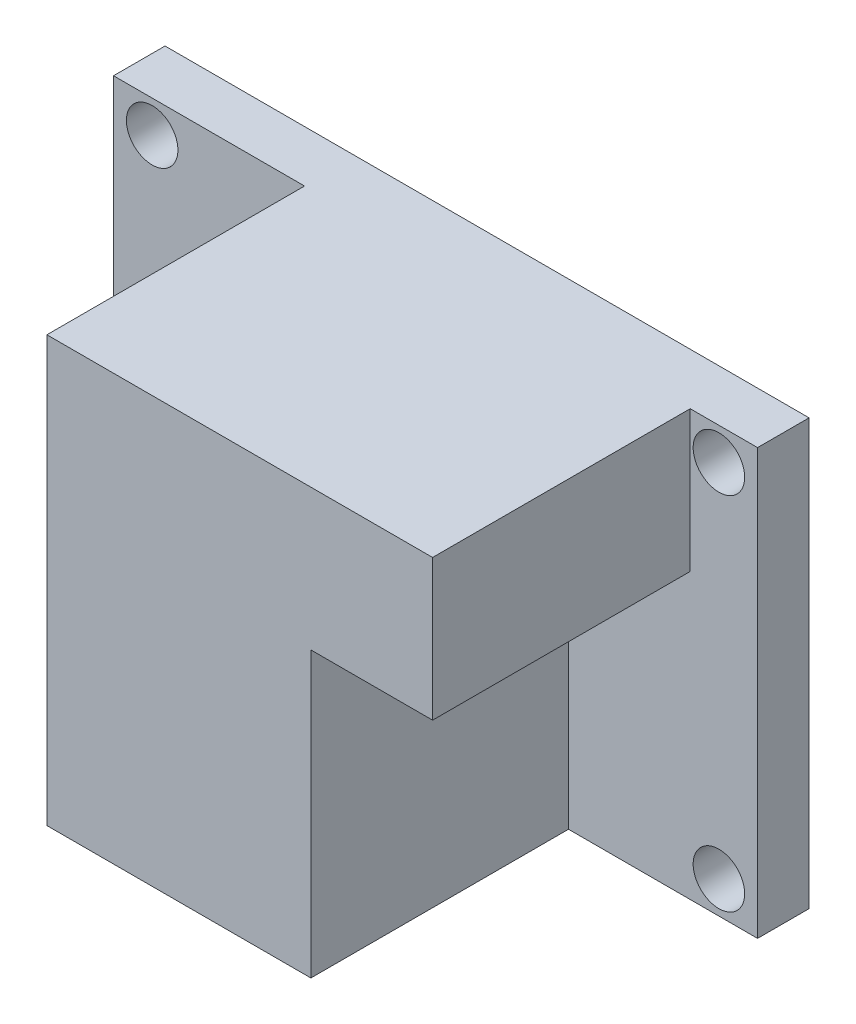
ISO-10303-21;
HEADER;
FILE_DESCRIPTION(('STEP AP214'),'2;1');
FILE_NAME('part.step','',(''),(''),'','','');
FILE_SCHEMA(('AUTOMOTIVE_DESIGN { 1 0 10303 214 1 1 1 1 }'));
ENDSEC;
DATA;
#1=APPLICATION_CONTEXT('core data for automotive mechanical design processes');
#2=APPLICATION_PROTOCOL_DEFINITION('international standard','automotive_design',2000,#1);
#3=PRODUCT_CONTEXT('',#1,'mechanical');
#4=PRODUCT('Part','Part','',(#3));
#5=PRODUCT_RELATED_PRODUCT_CATEGORY('part','',(#4));
#6=PRODUCT_DEFINITION_FORMATION('','',#4);
#7=PRODUCT_DEFINITION_CONTEXT('part definition',#1,'design');
#8=PRODUCT_DEFINITION('design','',#6,#7);
#9=PRODUCT_DEFINITION_SHAPE('','',#8);
#10=(LENGTH_UNIT() NAMED_UNIT(*) SI_UNIT(.MILLI.,.METRE.));
#11=(NAMED_UNIT(*) PLANE_ANGLE_UNIT() SI_UNIT($,.RADIAN.));
#12=(NAMED_UNIT(*) SI_UNIT($,.STERADIAN.) SOLID_ANGLE_UNIT());
#13=UNCERTAINTY_MEASURE_WITH_UNIT(LENGTH_MEASURE(1.E-05),#10,'distance_accuracy_value','');
#14=(GEOMETRIC_REPRESENTATION_CONTEXT(3) GLOBAL_UNCERTAINTY_ASSIGNED_CONTEXT((#13)) GLOBAL_UNIT_ASSIGNED_CONTEXT((#10,
#11,#12)) REPRESENTATION_CONTEXT('',''));
#15=CARTESIAN_POINT('',(0.,0.,0.));
#16=DIRECTION('',(0.,0.,1.));
#17=DIRECTION('',(1.,0.,0.));
#18=AXIS2_PLACEMENT_3D('',#15,#16,#17);
#19=CARTESIAN_POINT('',(0.,0.,4.));
#20=DIRECTION('',(0.,0.,1.));
#21=DIRECTION('',(1.,0.,0.));
#22=AXIS2_PLACEMENT_3D('',#19,#20,#21);
#23=PLANE('',#22);
#24=CARTESIAN_POINT('',(3.,30.5,4.));
#25=DIRECTION('',(0.,0.,1.));
#26=DIRECTION('',(1.,0.,0.));
#27=AXIS2_PLACEMENT_3D('',#24,#25,#26);
#28=CIRCLE('',#27,2.);
#29=CARTESIAN_POINT('',(5.,30.5,4.));
#30=VERTEX_POINT('',#29);
#31=EDGE_CURVE('E191',#30,#30,#28,.T.);
#32=ORIENTED_EDGE('',*,*,#31,.F.);
#33=EDGE_LOOP('',(#32));
#34=FACE_BOUND('',#33,.T.);
#35=CARTESIAN_POINT('',(3.00000000000001,2.5,4.));
#36=DIRECTION('',(0.,0.,1.));
#37=DIRECTION('',(1.,0.,0.));
#38=AXIS2_PLACEMENT_3D('',#35,#36,#37);
#39=CIRCLE('',#38,2.);
#40=CARTESIAN_POINT('',(5.00000000000001,2.5,4.));
#41=VERTEX_POINT('',#40);
#42=EDGE_CURVE('E188',#41,#41,#39,.T.);
#43=ORIENTED_EDGE('',*,*,#42,.F.);
#44=EDGE_LOOP('',(#43));
#45=FACE_BOUND('',#44,.T.);
#46=DIRECTION('',(1.,0.,0.));
#47=VECTOR('',#46,1.);
#48=CARTESIAN_POINT('',(0.,0.,4.));
#49=LINE('',#48,#47);
#50=CARTESIAN_POINT('',(0.,0.,4.));
#51=VERTEX_POINT('',#50);
#52=CARTESIAN_POINT('',(14.8297135358286,0.,4.));
#53=VERTEX_POINT('',#52);
#54=EDGE_CURVE('E179',#51,#53,#49,.T.);
#55=ORIENTED_EDGE('',*,*,#54,.T.);
#56=DIRECTION('',(0.,1.,0.));
#57=VECTOR('',#56,1.);
#58=CARTESIAN_POINT('',(14.8297135358286,0.,4.));
#59=LINE('',#58,#57);
#60=CARTESIAN_POINT('',(14.8297135358286,33.,4.));
#61=VERTEX_POINT('',#60);
#62=EDGE_CURVE('E176',#53,#61,#59,.T.);
#63=ORIENTED_EDGE('',*,*,#62,.T.);
#64=DIRECTION('',(1.,0.,0.));
#65=VECTOR('',#64,1.);
#66=CARTESIAN_POINT('',(0.,33.,4.));
#67=LINE('',#66,#65);
#68=CARTESIAN_POINT('',(0.,33.,4.));
#69=VERTEX_POINT('',#68);
#70=EDGE_CURVE('E134',#69,#61,#67,.T.);
#71=ORIENTED_EDGE('',*,*,#70,.F.);
#72=DIRECTION('',(0.,1.,0.));
#73=VECTOR('',#72,1.);
#74=CARTESIAN_POINT('',(0.,0.,4.));
#75=LINE('',#74,#73);
#76=EDGE_CURVE('E186',#51,#69,#75,.T.);
#77=ORIENTED_EDGE('',*,*,#76,.F.);
#78=EDGE_LOOP('',(#55,#63,#71,#77));
#79=FACE_BOUND('',#78,.T.);
#80=ADVANCED_FACE('F39',(#34,#45,#79),#23,.T.);
#81=CARTESIAN_POINT('',(0.,0.,4.));
#82=DIRECTION('',(0.,1.,0.));
#83=DIRECTION('',(0.,0.,1.));
#84=AXIS2_PLACEMENT_3D('',#81,#82,#83);
#85=PLANE('',#84);
#86=CARTESIAN_POINT('',(35.3229395715336,0.,4.));
#87=VERTEX_POINT('',#86);
#88=CARTESIAN_POINT('',(50.,0.,4.));
#89=VERTEX_POINT('',#88);
#90=EDGE_CURVE('E89',#87,#89,#49,.T.);
#91=ORIENTED_EDGE('',*,*,#90,.F.);
#92=DIRECTION('',(0.,0.,-1.));
#93=VECTOR('',#92,1.);
#94=CARTESIAN_POINT('',(35.3229395715336,0.,24.));
#95=LINE('',#94,#93);
#96=CARTESIAN_POINT('',(35.3229395715336,0.,24.));
#97=VERTEX_POINT('',#96);
#98=EDGE_CURVE('E166',#97,#87,#95,.T.);
#99=ORIENTED_EDGE('',*,*,#98,.F.);
#100=DIRECTION('',(1.,0.,0.));
#101=VECTOR('',#100,1.);
#102=CARTESIAN_POINT('',(0.,0.,24.));
#103=LINE('',#102,#101);
#104=CARTESIAN_POINT('',(14.8297135358286,0.,24.));
#105=VERTEX_POINT('',#104);
#106=EDGE_CURVE('E146',#105,#97,#103,.T.);
#107=ORIENTED_EDGE('',*,*,#106,.F.);
#108=DIRECTION('',(0.,0.,-1.));
#109=VECTOR('',#108,1.);
#110=CARTESIAN_POINT('',(14.8297135358286,0.,24.));
#111=LINE('',#110,#109);
#112=EDGE_CURVE('E138',#105,#53,#111,.T.);
#113=ORIENTED_EDGE('',*,*,#112,.T.);
#114=ORIENTED_EDGE('',*,*,#54,.F.);
#115=DIRECTION('',(0.,0.,-1.));
#116=VECTOR('',#115,1.);
#117=CARTESIAN_POINT('',(0.,0.,4.));
#118=LINE('',#117,#116);
#119=CARTESIAN_POINT('',(0.,0.,0.));
#120=VERTEX_POINT('',#119);
#121=EDGE_CURVE('E63',#51,#120,#118,.T.);
#122=ORIENTED_EDGE('',*,*,#121,.T.);
#123=DIRECTION('',(1.,0.,0.));
#124=VECTOR('',#123,1.);
#125=CARTESIAN_POINT('',(0.,0.,0.));
#126=LINE('',#125,#124);
#127=CARTESIAN_POINT('',(50.,0.,0.));
#128=VERTEX_POINT('',#127);
#129=EDGE_CURVE('E178',#120,#128,#126,.T.);
#130=ORIENTED_EDGE('',*,*,#129,.T.);
#131=DIRECTION('',(0.,0.,-1.));
#132=VECTOR('',#131,1.);
#133=CARTESIAN_POINT('',(50.,0.,4.));
#134=LINE('',#133,#132);
#135=EDGE_CURVE('E11',#89,#128,#134,.T.);
#136=ORIENTED_EDGE('',*,*,#135,.F.);
#137=EDGE_LOOP('',(#91,#99,#107,#113,#114,#122,#130,#136));
#138=FACE_BOUND('',#137,.T.);
#139=ADVANCED_FACE('F41',(#138),#85,.F.);
#140=CARTESIAN_POINT('',(50.,0.,4.));
#141=DIRECTION('',(-1.,0.,0.));
#142=DIRECTION('',(0.,-1.,0.));
#143=AXIS2_PLACEMENT_3D('',#140,#141,#142);
#144=PLANE('',#143);
#145=DIRECTION('',(0.,1.,0.));
#146=VECTOR('',#145,1.);
#147=CARTESIAN_POINT('',(50.,0.,0.));
#148=LINE('',#147,#146);
#149=CARTESIAN_POINT('',(50.,33.,0.));
#150=VERTEX_POINT('',#149);
#151=EDGE_CURVE('E201',#128,#150,#148,.T.);
#152=ORIENTED_EDGE('',*,*,#151,.T.);
#153=DIRECTION('',(0.,0.,-1.));
#154=VECTOR('',#153,1.);
#155=CARTESIAN_POINT('',(50.,33.,4.));
#156=LINE('',#155,#154);
#157=CARTESIAN_POINT('',(50.,33.,4.));
#158=VERTEX_POINT('',#157);
#159=EDGE_CURVE('E47',#158,#150,#156,.T.);
#160=ORIENTED_EDGE('',*,*,#159,.F.);
#161=DIRECTION('',(0.,1.,0.));
#162=VECTOR('',#161,1.);
#163=CARTESIAN_POINT('',(50.,0.,4.));
#164=LINE('',#163,#162);
#165=EDGE_CURVE('E182',#89,#158,#164,.T.);
#166=ORIENTED_EDGE('',*,*,#165,.F.);
#167=ORIENTED_EDGE('',*,*,#135,.T.);
#168=EDGE_LOOP('',(#152,#160,#166,#167));
#169=FACE_BOUND('',#168,.T.);
#170=ADVANCED_FACE('F228',(#169),#144,.F.);
#171=CARTESIAN_POINT('',(0.,33.,4.));
#172=DIRECTION('',(0.,1.,0.));
#173=DIRECTION('',(0.,0.,1.));
#174=AXIS2_PLACEMENT_3D('',#171,#172,#173);
#175=PLANE('',#174);
#176=ORIENTED_EDGE('',*,*,#159,.T.);
#177=DIRECTION('',(1.,0.,0.));
#178=VECTOR('',#177,1.);
#179=CARTESIAN_POINT('',(0.,33.,0.));
#180=LINE('',#179,#178);
#181=CARTESIAN_POINT('',(0.,33.,0.));
#182=VERTEX_POINT('',#181);
#183=EDGE_CURVE('E204',#182,#150,#180,.T.);
#184=ORIENTED_EDGE('',*,*,#183,.F.);
#185=DIRECTION('',(0.,0.,-1.));
#186=VECTOR('',#185,1.);
#187=CARTESIAN_POINT('',(0.,33.,4.));
#188=LINE('',#187,#186);
#189=EDGE_CURVE('E222',#69,#182,#188,.T.);
#190=ORIENTED_EDGE('',*,*,#189,.F.);
#191=ORIENTED_EDGE('',*,*,#70,.T.);
#192=DIRECTION('',(0.,0.,-1.));
#193=VECTOR('',#192,1.);
#194=CARTESIAN_POINT('',(14.8297135358286,33.,24.));
#195=LINE('',#194,#193);
#196=CARTESIAN_POINT('',(14.8297135358286,33.,24.));
#197=VERTEX_POINT('',#196);
#198=EDGE_CURVE('E126',#197,#61,#195,.T.);
#199=ORIENTED_EDGE('',*,*,#198,.F.);
#200=DIRECTION('',(1.,0.,0.));
#201=VECTOR('',#200,1.);
#202=CARTESIAN_POINT('',(0.,33.,24.));
#203=LINE('',#202,#201);
#204=CARTESIAN_POINT('',(44.7715297686811,33.,24.));
#205=VERTEX_POINT('',#204);
#206=EDGE_CURVE('E132',#197,#205,#203,.T.);
#207=ORIENTED_EDGE('',*,*,#206,.T.);
#208=DIRECTION('',(0.,0.,-1.));
#209=VECTOR('',#208,1.);
#210=CARTESIAN_POINT('',(44.7715297686811,33.,24.));
#211=LINE('',#210,#209);
#212=CARTESIAN_POINT('',(44.7715297686811,33.,4.));
#213=VERTEX_POINT('',#212);
#214=EDGE_CURVE('E160',#205,#213,#211,.T.);
#215=ORIENTED_EDGE('',*,*,#214,.T.);
#216=EDGE_CURVE('E184',#213,#158,#67,.T.);
#217=ORIENTED_EDGE('',*,*,#216,.T.);
#218=EDGE_LOOP('',(#176,#184,#190,#191,#199,#207,#215,#217));
#219=FACE_BOUND('',#218,.T.);
#220=ADVANCED_FACE('F129',(#219),#175,.T.);
#221=CARTESIAN_POINT('',(47.,2.50000000000002,4.));
#222=DIRECTION('',(0.,0.,-1.));
#223=DIRECTION('',(-1.,0.,0.));
#224=AXIS2_PLACEMENT_3D('',#221,#222,#223);
#225=CYLINDRICAL_SURFACE('',#224,2.);
#226=CARTESIAN_POINT('',(47.,2.50000000000002,4.));
#227=DIRECTION('',(0.,0.,1.));
#228=DIRECTION('',(1.,0.,0.));
#229=AXIS2_PLACEMENT_3D('',#226,#227,#228);
#230=CIRCLE('',#229,2.);
#231=CARTESIAN_POINT('',(49.,2.50000000000002,4.));
#232=VERTEX_POINT('',#231);
#233=EDGE_CURVE('E194',#232,#232,#230,.F.);
#234=ORIENTED_EDGE('',*,*,#233,.F.);
#235=EDGE_LOOP('',(#234));
#236=FACE_BOUND('',#235,.T.);
#237=CARTESIAN_POINT('',(47.,2.50000000000002,0.));
#238=DIRECTION('',(0.,0.,1.));
#239=DIRECTION('',(1.,0.,0.));
#240=AXIS2_PLACEMENT_3D('',#237,#238,#239);
#241=CIRCLE('',#240,2.);
#242=CARTESIAN_POINT('',(49.,2.50000000000002,0.));
#243=VERTEX_POINT('',#242);
#244=EDGE_CURVE('E215',#243,#243,#241,.F.);
#245=ORIENTED_EDGE('',*,*,#244,.T.);
#246=EDGE_LOOP('',(#245));
#247=FACE_BOUND('',#246,.T.);
#248=ADVANCED_FACE('F268',(#236,#247),#225,.F.);
#249=CARTESIAN_POINT('',(3.,30.5,4.));
#250=DIRECTION('',(0.,0.,-1.));
#251=DIRECTION('',(-1.,0.,0.));
#252=AXIS2_PLACEMENT_3D('',#249,#250,#251);
#253=CYLINDRICAL_SURFACE('',#252,2.);
#254=ORIENTED_EDGE('',*,*,#31,.T.);
#255=EDGE_LOOP('',(#254));
#256=FACE_BOUND('',#255,.T.);
#257=CARTESIAN_POINT('',(3.,30.5,0.));
#258=DIRECTION('',(0.,0.,1.));
#259=DIRECTION('',(1.,0.,0.));
#260=AXIS2_PLACEMENT_3D('',#257,#258,#259);
#261=CIRCLE('',#260,2.);
#262=CARTESIAN_POINT('',(5.,30.5,0.));
#263=VERTEX_POINT('',#262);
#264=EDGE_CURVE('E212',#263,#263,#261,.T.);
#265=ORIENTED_EDGE('',*,*,#264,.F.);
#266=EDGE_LOOP('',(#265));
#267=FACE_BOUND('',#266,.T.);
#268=ADVANCED_FACE('F265',(#256,#267),#253,.F.);
#269=CARTESIAN_POINT('',(3.00000000000001,2.5,4.));
#270=DIRECTION('',(0.,0.,-1.));
#271=DIRECTION('',(-1.,0.,0.));
#272=AXIS2_PLACEMENT_3D('',#269,#270,#271);
#273=CYLINDRICAL_SURFACE('',#272,2.);
#274=ORIENTED_EDGE('',*,*,#42,.T.);
#275=EDGE_LOOP('',(#274));
#276=FACE_BOUND('',#275,.T.);
#277=CARTESIAN_POINT('',(3.00000000000001,2.5,0.));
#278=DIRECTION('',(0.,0.,1.));
#279=DIRECTION('',(1.,0.,0.));
#280=AXIS2_PLACEMENT_3D('',#277,#278,#279);
#281=CIRCLE('',#280,2.);
#282=CARTESIAN_POINT('',(5.00000000000001,2.5,0.));
#283=VERTEX_POINT('',#282);
#284=EDGE_CURVE('E209',#283,#283,#281,.T.);
#285=ORIENTED_EDGE('',*,*,#284,.F.);
#286=EDGE_LOOP('',(#285));
#287=FACE_BOUND('',#286,.T.);
#288=ADVANCED_FACE('F267',(#276,#287),#273,.F.);
#289=CARTESIAN_POINT('',(0.,0.,4.));
#290=DIRECTION('',(-1.,0.,0.));
#291=DIRECTION('',(0.,-1.,0.));
#292=AXIS2_PLACEMENT_3D('',#289,#290,#291);
#293=PLANE('',#292);
#294=DIRECTION('',(0.,1.,0.));
#295=VECTOR('',#294,1.);
#296=CARTESIAN_POINT('',(0.,0.,0.));
#297=LINE('',#296,#295);
#298=EDGE_CURVE('E206',#120,#182,#297,.T.);
#299=ORIENTED_EDGE('',*,*,#298,.F.);
#300=ORIENTED_EDGE('',*,*,#121,.F.);
#301=ORIENTED_EDGE('',*,*,#76,.T.);
#302=ORIENTED_EDGE('',*,*,#189,.T.);
#303=EDGE_LOOP('',(#299,#300,#301,#302));
#304=FACE_BOUND('',#303,.T.);
#305=ADVANCED_FACE('F233',(#304),#293,.T.);
#306=CARTESIAN_POINT('',(47.,30.5,4.));
#307=DIRECTION('',(0.,0.,-1.));
#308=DIRECTION('',(-1.,0.,0.));
#309=AXIS2_PLACEMENT_3D('',#306,#307,#308);
#310=CYLINDRICAL_SURFACE('',#309,2.);
#311=CARTESIAN_POINT('',(47.,30.5,4.));
#312=DIRECTION('',(0.,0.,1.));
#313=DIRECTION('',(1.,0.,0.));
#314=AXIS2_PLACEMENT_3D('',#311,#312,#313);
#315=CIRCLE('',#314,2.);
#316=CARTESIAN_POINT('',(49.,30.5,4.));
#317=VERTEX_POINT('',#316);
#318=EDGE_CURVE('E197',#317,#317,#315,.F.);
#319=ORIENTED_EDGE('',*,*,#318,.F.);
#320=EDGE_LOOP('',(#319));
#321=FACE_BOUND('',#320,.T.);
#322=CARTESIAN_POINT('',(47.,30.5,0.));
#323=DIRECTION('',(0.,0.,1.));
#324=DIRECTION('',(1.,0.,0.));
#325=AXIS2_PLACEMENT_3D('',#322,#323,#324);
#326=CIRCLE('',#325,2.);
#327=CARTESIAN_POINT('',(49.,30.5,0.));
#328=VERTEX_POINT('',#327);
#329=EDGE_CURVE('E218',#328,#328,#326,.F.);
#330=ORIENTED_EDGE('',*,*,#329,.T.);
#331=EDGE_LOOP('',(#330));
#332=FACE_BOUND('',#331,.T.);
#333=ADVANCED_FACE('F247',(#321,#332),#310,.F.);
#334=DIRECTION('',(0.,1.,0.));
#335=VECTOR('',#334,1.);
#336=CARTESIAN_POINT('',(35.3229395715336,0.,4.));
#337=LINE('',#336,#335);
#338=CARTESIAN_POINT('',(35.3229395715336,22.0585016134558,4.));
#339=VERTEX_POINT('',#338);
#340=EDGE_CURVE('E174',#87,#339,#337,.T.);
#341=ORIENTED_EDGE('',*,*,#340,.F.);
#342=ORIENTED_EDGE('',*,*,#90,.T.);
#343=ORIENTED_EDGE('',*,*,#165,.T.);
#344=ORIENTED_EDGE('',*,*,#216,.F.);
#345=DIRECTION('',(0.,-1.,0.));
#346=VECTOR('',#345,1.);
#347=CARTESIAN_POINT('',(44.7715297686811,0.,4.));
#348=LINE('',#347,#346);
#349=CARTESIAN_POINT('',(44.7715297686811,22.0585016134558,4.));
#350=VERTEX_POINT('',#349);
#351=EDGE_CURVE('E137',#213,#350,#348,.T.);
#352=ORIENTED_EDGE('',*,*,#351,.T.);
#353=DIRECTION('',(-1.,0.,0.));
#354=VECTOR('',#353,1.);
#355=CARTESIAN_POINT('',(0.,22.0585016134558,4.));
#356=LINE('',#355,#354);
#357=EDGE_CURVE('E171',#350,#339,#356,.T.);
#358=ORIENTED_EDGE('',*,*,#357,.T.);
#359=EDGE_LOOP('',(#341,#342,#343,#344,#352,#358));
#360=FACE_BOUND('',#359,.T.);
#361=ORIENTED_EDGE('',*,*,#233,.T.);
#362=EDGE_LOOP('',(#361));
#363=FACE_BOUND('',#362,.T.);
#364=ORIENTED_EDGE('',*,*,#318,.T.);
#365=EDGE_LOOP('',(#364));
#366=FACE_BOUND('',#365,.T.);
#367=ADVANCED_FACE('F244',(#360,#363,#366),#23,.T.);
#368=CARTESIAN_POINT('',(0.,0.,0.));
#369=DIRECTION('',(0.,0.,1.));
#370=DIRECTION('',(1.,0.,0.));
#371=AXIS2_PLACEMENT_3D('',#368,#369,#370);
#372=PLANE('',#371);
#373=ORIENTED_EDGE('',*,*,#151,.F.);
#374=ORIENTED_EDGE('',*,*,#129,.F.);
#375=ORIENTED_EDGE('',*,*,#298,.T.);
#376=ORIENTED_EDGE('',*,*,#183,.T.);
#377=EDGE_LOOP('',(#373,#374,#375,#376));
#378=FACE_BOUND('',#377,.T.);
#379=ORIENTED_EDGE('',*,*,#244,.F.);
#380=EDGE_LOOP('',(#379));
#381=FACE_BOUND('',#380,.T.);
#382=ORIENTED_EDGE('',*,*,#329,.F.);
#383=EDGE_LOOP('',(#382));
#384=FACE_BOUND('',#383,.T.);
#385=ORIENTED_EDGE('',*,*,#284,.T.);
#386=EDGE_LOOP('',(#385));
#387=FACE_BOUND('',#386,.T.);
#388=ORIENTED_EDGE('',*,*,#264,.T.);
#389=EDGE_LOOP('',(#388));
#390=FACE_BOUND('',#389,.T.);
#391=ADVANCED_FACE('F231',(#378,#381,#384,#387,#390),#372,.F.);
#392=CARTESIAN_POINT('',(14.8297135358286,0.,24.));
#393=DIRECTION('',(1.,0.,0.));
#394=DIRECTION('',(0.,0.,-1.));
#395=AXIS2_PLACEMENT_3D('',#392,#393,#394);
#396=PLANE('',#395);
#397=ORIENTED_EDGE('',*,*,#62,.F.);
#398=ORIENTED_EDGE('',*,*,#112,.F.);
#399=DIRECTION('',(0.,-1.,0.));
#400=VECTOR('',#399,1.);
#401=CARTESIAN_POINT('',(14.8297135358286,0.,24.));
#402=LINE('',#401,#400);
#403=EDGE_CURVE('E141',#197,#105,#402,.T.);
#404=ORIENTED_EDGE('',*,*,#403,.F.);
#405=ORIENTED_EDGE('',*,*,#198,.T.);
#406=EDGE_LOOP('',(#397,#398,#404,#405));
#407=FACE_BOUND('',#406,.T.);
#408=ADVANCED_FACE('F142',(#407),#396,.F.);
#409=CARTESIAN_POINT('',(35.3229395715336,0.,24.));
#410=DIRECTION('',(1.,0.,0.));
#411=DIRECTION('',(0.,0.,-1.));
#412=AXIS2_PLACEMENT_3D('',#409,#410,#411);
#413=PLANE('',#412);
#414=ORIENTED_EDGE('',*,*,#98,.T.);
#415=ORIENTED_EDGE('',*,*,#340,.T.);
#416=DIRECTION('',(0.,0.,-1.));
#417=VECTOR('',#416,1.);
#418=CARTESIAN_POINT('',(35.3229395715336,22.0585016134558,24.));
#419=LINE('',#418,#417);
#420=CARTESIAN_POINT('',(35.3229395715336,22.0585016134558,24.));
#421=VERTEX_POINT('',#420);
#422=EDGE_CURVE('E163',#421,#339,#419,.T.);
#423=ORIENTED_EDGE('',*,*,#422,.F.);
#424=DIRECTION('',(0.,-1.,0.));
#425=VECTOR('',#424,1.);
#426=CARTESIAN_POINT('',(35.3229395715336,0.,24.));
#427=LINE('',#426,#425);
#428=EDGE_CURVE('E154',#421,#97,#427,.T.);
#429=ORIENTED_EDGE('',*,*,#428,.T.);
#430=EDGE_LOOP('',(#414,#415,#423,#429));
#431=FACE_BOUND('',#430,.T.);
#432=ADVANCED_FACE('F240',(#431),#413,.T.);
#433=CARTESIAN_POINT('',(0.,22.0585016134558,24.));
#434=DIRECTION('',(0.,1.,0.));
#435=DIRECTION('',(0.,0.,1.));
#436=AXIS2_PLACEMENT_3D('',#433,#434,#435);
#437=PLANE('',#436);
#438=ORIENTED_EDGE('',*,*,#357,.F.);
#439=DIRECTION('',(0.,0.,-1.));
#440=VECTOR('',#439,1.);
#441=CARTESIAN_POINT('',(44.7715297686811,22.0585016134558,24.));
#442=LINE('',#441,#440);
#443=CARTESIAN_POINT('',(44.7715297686811,22.0585016134558,24.));
#444=VERTEX_POINT('',#443);
#445=EDGE_CURVE('E54',#444,#350,#442,.T.);
#446=ORIENTED_EDGE('',*,*,#445,.F.);
#447=DIRECTION('',(1.,0.,0.));
#448=VECTOR('',#447,1.);
#449=CARTESIAN_POINT('',(0.,22.0585016134558,24.));
#450=LINE('',#449,#448);
#451=EDGE_CURVE('E157',#421,#444,#450,.T.);
#452=ORIENTED_EDGE('',*,*,#451,.F.);
#453=ORIENTED_EDGE('',*,*,#422,.T.);
#454=EDGE_LOOP('',(#438,#446,#452,#453));
#455=FACE_BOUND('',#454,.T.);
#456=ADVANCED_FACE('F242',(#455),#437,.F.);
#457=CARTESIAN_POINT('',(44.7715297686811,0.,24.));
#458=DIRECTION('',(-1.,0.,0.));
#459=DIRECTION('',(0.,0.,1.));
#460=AXIS2_PLACEMENT_3D('',#457,#458,#459);
#461=PLANE('',#460);
#462=ORIENTED_EDGE('',*,*,#351,.F.);
#463=ORIENTED_EDGE('',*,*,#214,.F.);
#464=DIRECTION('',(0.,1.,0.));
#465=VECTOR('',#464,1.);
#466=CARTESIAN_POINT('',(44.7715297686811,0.,24.));
#467=LINE('',#466,#465);
#468=EDGE_CURVE('E149',#444,#205,#467,.T.);
#469=ORIENTED_EDGE('',*,*,#468,.F.);
#470=ORIENTED_EDGE('',*,*,#445,.T.);
#471=EDGE_LOOP('',(#462,#463,#469,#470));
#472=FACE_BOUND('',#471,.T.);
#473=ADVANCED_FACE('F243',(#472),#461,.F.);
#474=CARTESIAN_POINT('',(0.,0.,24.));
#475=DIRECTION('',(0.,0.,1.));
#476=DIRECTION('',(1.,0.,0.));
#477=AXIS2_PLACEMENT_3D('',#474,#475,#476);
#478=PLANE('',#477);
#479=ORIENTED_EDGE('',*,*,#206,.F.);
#480=ORIENTED_EDGE('',*,*,#403,.T.);
#481=ORIENTED_EDGE('',*,*,#106,.T.);
#482=ORIENTED_EDGE('',*,*,#428,.F.);
#483=ORIENTED_EDGE('',*,*,#451,.T.);
#484=ORIENTED_EDGE('',*,*,#468,.T.);
#485=EDGE_LOOP('',(#479,#480,#481,#482,#483,#484));
#486=FACE_BOUND('',#485,.T.);
#487=ADVANCED_FACE('F148',(#486),#478,.T.);
#488=CLOSED_SHELL('',(#80,#139,#170,#220,#248,#268,#288,#305,#333,#367,#391,#408,#432,#456,#473,#487));
#489=MANIFOLD_SOLID_BREP('B2',#488);
#490=ADVANCED_BREP_SHAPE_REPRESENTATION('',(#18,#489),#14);
#491=SHAPE_DEFINITION_REPRESENTATION(#9,#490);
ENDSEC;
END-ISO-10303-21;
